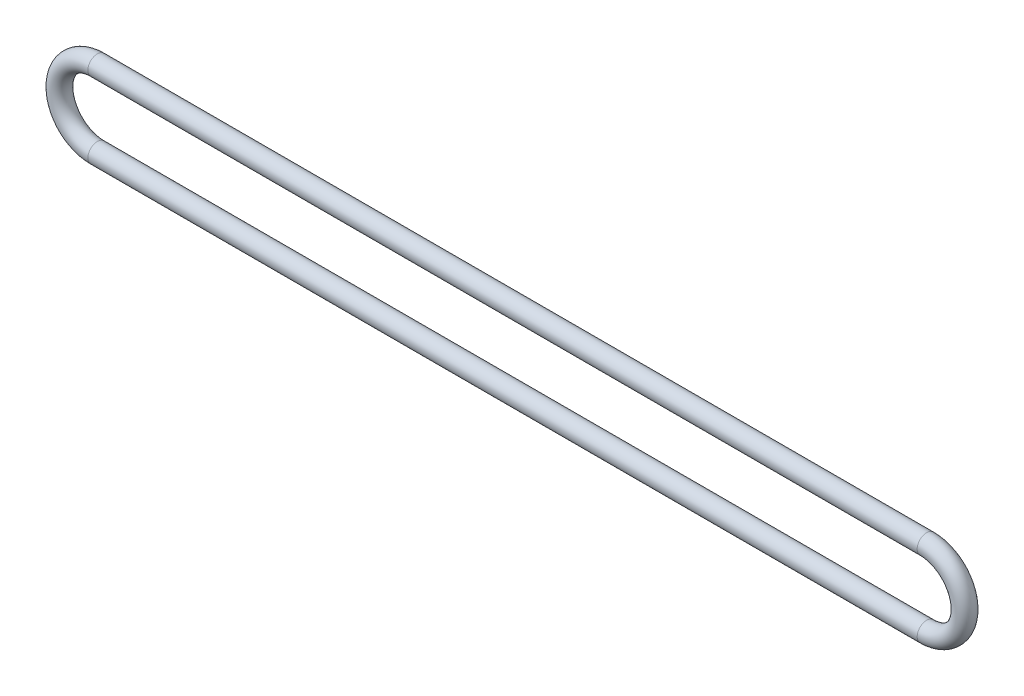
ISO-10303-21;
HEADER;
FILE_DESCRIPTION(('STEP AP214'),'2;1');
FILE_NAME('part.step','',(''),(''),'','','');
FILE_SCHEMA(('AUTOMOTIVE_DESIGN { 1 0 10303 214 1 1 1 1 }'));
ENDSEC;
DATA;
#1=APPLICATION_CONTEXT('core data for automotive mechanical design processes');
#2=APPLICATION_PROTOCOL_DEFINITION('international standard','automotive_design',2000,#1);
#3=PRODUCT_CONTEXT('',#1,'mechanical');
#4=PRODUCT('Part','Part','',(#3));
#5=PRODUCT_RELATED_PRODUCT_CATEGORY('part','',(#4));
#6=PRODUCT_DEFINITION_FORMATION('','',#4);
#7=PRODUCT_DEFINITION_CONTEXT('part definition',#1,'design');
#8=PRODUCT_DEFINITION('design','',#6,#7);
#9=PRODUCT_DEFINITION_SHAPE('','',#8);
#10=(LENGTH_UNIT() NAMED_UNIT(*) SI_UNIT(.MILLI.,.METRE.));
#11=(NAMED_UNIT(*) PLANE_ANGLE_UNIT() SI_UNIT($,.RADIAN.));
#12=(NAMED_UNIT(*) SI_UNIT($,.STERADIAN.) SOLID_ANGLE_UNIT());
#13=UNCERTAINTY_MEASURE_WITH_UNIT(LENGTH_MEASURE(1.E-05),#10,'distance_accuracy_value','');
#14=(GEOMETRIC_REPRESENTATION_CONTEXT(3) GLOBAL_UNCERTAINTY_ASSIGNED_CONTEXT((#13)) GLOBAL_UNIT_ASSIGNED_CONTEXT((#10,
#11,#12)) REPRESENTATION_CONTEXT('',''));
#15=CARTESIAN_POINT('',(0.,0.,0.));
#16=DIRECTION('',(0.,0.,1.));
#17=DIRECTION('',(1.,0.,0.));
#18=AXIS2_PLACEMENT_3D('',#15,#16,#17);
#19=CARTESIAN_POINT('',(-4.44089209850063E-13,50.,0.));
#20=DIRECTION('',(1.,0.,0.));
#21=DIRECTION('',(0.,0.,-1.));
#22=AXIS2_PLACEMENT_3D('',#19,#20,#21);
#23=CYLINDRICAL_SURFACE('',#22,12.5);
#24=CARTESIAN_POINT('',(1092.79985020134,50.,0.));
#25=DIRECTION('',(1.,0.,0.));
#26=DIRECTION('',(0.,0.,-1.));
#27=AXIS2_PLACEMENT_3D('',#24,#25,#26);
#28=CIRCLE('',#27,12.5);
#29=CARTESIAN_POINT('',(1092.79985020134,62.5,0.));
#30=VERTEX_POINT('',#29);
#31=EDGE_CURVE('E45',#30,#30,#28,.T.);
#32=ORIENTED_EDGE('',*,*,#31,.F.);
#33=EDGE_LOOP('',(#32));
#34=FACE_BOUND('',#33,.T.);
#35=CARTESIAN_POINT('',(-4.44089209850063E-13,49.9999999999998,0.));
#36=DIRECTION('',(1.,0.,0.));
#37=DIRECTION('',(0.,0.,-1.));
#38=AXIS2_PLACEMENT_3D('',#35,#36,#37);
#39=CIRCLE('',#38,12.5);
#40=CARTESIAN_POINT('',(-5.5511151231258E-13,62.5,0.));
#41=VERTEX_POINT('',#40);
#42=EDGE_CURVE('E10',#41,#41,#39,.T.);
#43=ORIENTED_EDGE('',*,*,#42,.T.);
#44=EDGE_LOOP('',(#43));
#45=FACE_BOUND('',#44,.T.);
#46=ADVANCED_FACE('F31',(#34,#45),#23,.T.);
#47=CARTESIAN_POINT('',(0.,0.,0.));
#48=DIRECTION('',(0.,0.,-1.));
#49=DIRECTION('',(-1.,0.,0.));
#50=AXIS2_PLACEMENT_3D('',#47,#48,#49);
#51=TOROIDAL_SURFACE('',#50,50.,12.5);
#52=CARTESIAN_POINT('',(4.44089209850063E-13,-50.,0.));
#53=DIRECTION('',(-1.,0.,0.));
#54=DIRECTION('',(0.,0.,-1.));
#55=AXIS2_PLACEMENT_3D('',#52,#53,#54);
#56=CIRCLE('',#55,12.5);
#57=CARTESIAN_POINT('',(5.55111512312578E-13,-62.5,0.));
#58=VERTEX_POINT('',#57);
#59=EDGE_CURVE('E37',#58,#58,#56,.T.);
#60=CARTESIAN_POINT('',(0.,0.,0.));
#61=DIRECTION('',(0.,0.,-1.));
#62=DIRECTION('',(-1.,0.,0.));
#63=AXIS2_PLACEMENT_3D('',#60,#61,#62);
#64=CIRCLE('',#63,62.5);
#65=EDGE_CURVE('',#58,#41,#64,.T.);
#66=ORIENTED_EDGE('',*,*,#59,.T.);
#67=ORIENTED_EDGE('',*,*,#42,.F.);
#68=ORIENTED_EDGE('',*,*,#65,.T.);
#69=ORIENTED_EDGE('',*,*,#65,.F.);
#70=EDGE_LOOP('',(#66,#68,#67,#69));
#71=FACE_BOUND('',#70,.T.);
#72=ADVANCED_FACE('F54',(#71),#51,.T.);
#73=CARTESIAN_POINT('',(1092.79985020134,-50.,0.));
#74=DIRECTION('',(-1.,0.,0.));
#75=DIRECTION('',(0.,0.,1.));
#76=AXIS2_PLACEMENT_3D('',#73,#74,#75);
#77=CYLINDRICAL_SURFACE('',#76,12.5);
#78=ORIENTED_EDGE('',*,*,#59,.F.);
#79=EDGE_LOOP('',(#78));
#80=FACE_BOUND('',#79,.T.);
#81=CARTESIAN_POINT('',(1092.79985020134,-50.,0.));
#82=DIRECTION('',(-1.,0.,0.));
#83=DIRECTION('',(0.,0.,-1.));
#84=AXIS2_PLACEMENT_3D('',#81,#82,#83);
#85=CIRCLE('',#84,12.5);
#86=CARTESIAN_POINT('',(1092.79985020134,-62.5,0.));
#87=VERTEX_POINT('',#86);
#88=EDGE_CURVE('E41',#87,#87,#85,.T.);
#89=ORIENTED_EDGE('',*,*,#88,.T.);
#90=EDGE_LOOP('',(#89));
#91=FACE_BOUND('',#90,.T.);
#92=ADVANCED_FACE('F58',(#80,#91),#77,.T.);
#93=CARTESIAN_POINT('',(1092.79985020134,0.,0.));
#94=DIRECTION('',(0.,0.,-1.));
#95=DIRECTION('',(-1.,0.,0.));
#96=AXIS2_PLACEMENT_3D('',#93,#94,#95);
#97=TOROIDAL_SURFACE('',#96,50.,12.5);
#98=CARTESIAN_POINT('',(1092.79985020134,0.,0.));
#99=DIRECTION('',(0.,0.,-1.));
#100=DIRECTION('',(-1.,0.,0.));
#101=AXIS2_PLACEMENT_3D('',#98,#99,#100);
#102=CIRCLE('',#101,62.5);
#103=EDGE_CURVE('',#30,#87,#102,.T.);
#104=ORIENTED_EDGE('',*,*,#31,.T.);
#105=ORIENTED_EDGE('',*,*,#88,.F.);
#106=ORIENTED_EDGE('',*,*,#103,.T.);
#107=ORIENTED_EDGE('',*,*,#103,.F.);
#108=EDGE_LOOP('',(#104,#106,#105,#107));
#109=FACE_BOUND('',#108,.T.);
#110=ADVANCED_FACE('F51',(#109),#97,.T.);
#111=CLOSED_SHELL('',(#46,#72,#92,#110));
#112=MANIFOLD_SOLID_BREP('B2',#111);
#113=ADVANCED_BREP_SHAPE_REPRESENTATION('',(#18,#112),#14);
#114=SHAPE_DEFINITION_REPRESENTATION(#9,#113);
ENDSEC;
END-ISO-10303-21;
